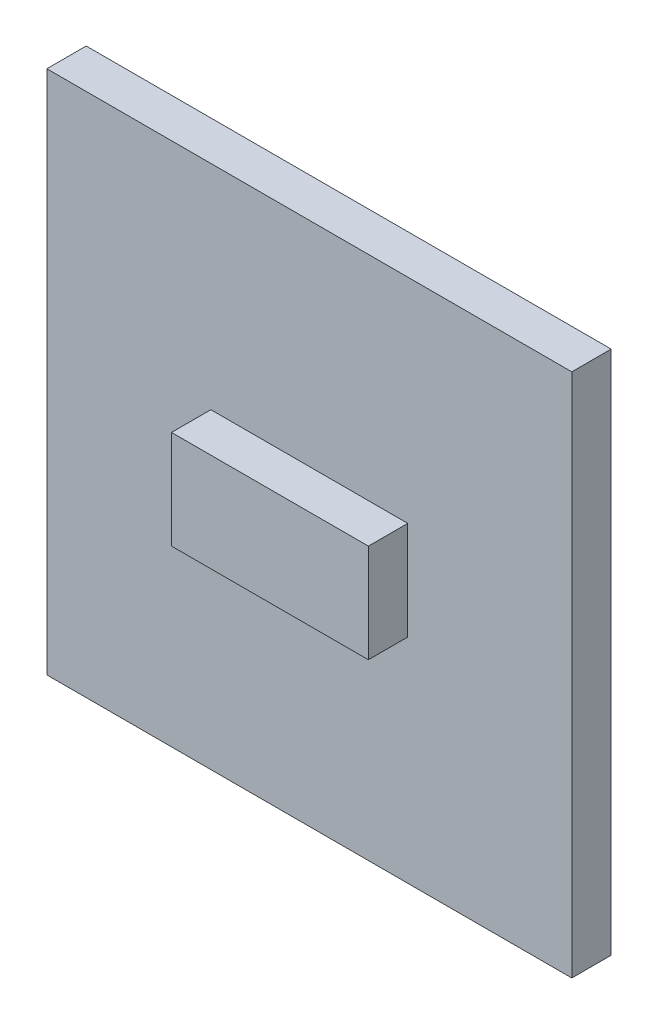
ISO-10303-21;
HEADER;
FILE_DESCRIPTION(('STEP AP214'),'2;1');
FILE_NAME('part.step','',(''),(''),'','','');
FILE_SCHEMA(('AUTOMOTIVE_DESIGN { 1 0 10303 214 1 1 1 1 }'));
ENDSEC;
DATA;
#1=APPLICATION_CONTEXT('core data for automotive mechanical design processes');
#2=APPLICATION_PROTOCOL_DEFINITION('international standard','automotive_design',2000,#1);
#3=PRODUCT_CONTEXT('',#1,'mechanical');
#4=PRODUCT('Part','Part','',(#3));
#5=PRODUCT_RELATED_PRODUCT_CATEGORY('part','',(#4));
#6=PRODUCT_DEFINITION_FORMATION('','',#4);
#7=PRODUCT_DEFINITION_CONTEXT('part definition',#1,'design');
#8=PRODUCT_DEFINITION('design','',#6,#7);
#9=PRODUCT_DEFINITION_SHAPE('','',#8);
#10=(LENGTH_UNIT() NAMED_UNIT(*) SI_UNIT(.MILLI.,.METRE.));
#11=(NAMED_UNIT(*) PLANE_ANGLE_UNIT() SI_UNIT($,.RADIAN.));
#12=(NAMED_UNIT(*) SI_UNIT($,.STERADIAN.) SOLID_ANGLE_UNIT());
#13=UNCERTAINTY_MEASURE_WITH_UNIT(LENGTH_MEASURE(1.E-05),#10,'distance_accuracy_value','');
#14=(GEOMETRIC_REPRESENTATION_CONTEXT(3) GLOBAL_UNCERTAINTY_ASSIGNED_CONTEXT((#13)) GLOBAL_UNIT_ASSIGNED_CONTEXT((#10,
#11,#12)) REPRESENTATION_CONTEXT('',''));
#15=CARTESIAN_POINT('',(0.,0.,0.));
#16=DIRECTION('',(0.,0.,1.));
#17=DIRECTION('',(1.,0.,0.));
#18=AXIS2_PLACEMENT_3D('',#15,#16,#17);
#19=CARTESIAN_POINT('',(0.,0.,1.2));
#20=DIRECTION('',(1.,0.,0.));
#21=DIRECTION('',(0.,1.,0.));
#22=AXIS2_PLACEMENT_3D('',#19,#20,#21);
#23=PLANE('',#22);
#24=DIRECTION('',(0.,-1.,0.));
#25=VECTOR('',#24,1.);
#26=CARTESIAN_POINT('',(0.,0.,0.));
#27=LINE('',#26,#25);
#28=CARTESIAN_POINT('',(0.,0.,0.));
#29=VERTEX_POINT('',#28);
#30=CARTESIAN_POINT('',(0.,-16.,0.));
#31=VERTEX_POINT('',#30);
#32=EDGE_CURVE('E117',#29,#31,#27,.T.);
#33=ORIENTED_EDGE('',*,*,#32,.T.);
#34=DIRECTION('',(0.,0.,-1.));
#35=VECTOR('',#34,1.);
#36=CARTESIAN_POINT('',(0.,-16.,1.2));
#37=LINE('',#36,#35);
#38=CARTESIAN_POINT('',(0.,-16.,1.2));
#39=VERTEX_POINT('',#38);
#40=EDGE_CURVE('E11',#39,#31,#37,.T.);
#41=ORIENTED_EDGE('',*,*,#40,.F.);
#42=DIRECTION('',(0.,-1.,0.));
#43=VECTOR('',#42,1.);
#44=CARTESIAN_POINT('',(0.,0.,1.2));
#45=LINE('',#44,#43);
#46=CARTESIAN_POINT('',(0.,0.,1.2));
#47=VERTEX_POINT('',#46);
#48=EDGE_CURVE('E126',#47,#39,#45,.T.);
#49=ORIENTED_EDGE('',*,*,#48,.F.);
#50=DIRECTION('',(0.,0.,-1.));
#51=VECTOR('',#50,1.);
#52=CARTESIAN_POINT('',(0.,0.,1.2));
#53=LINE('',#52,#51);
#54=EDGE_CURVE('E135',#47,#29,#53,.T.);
#55=ORIENTED_EDGE('',*,*,#54,.T.);
#56=EDGE_LOOP('',(#33,#41,#49,#55));
#57=FACE_BOUND('',#56,.T.);
#58=ADVANCED_FACE('F33',(#57),#23,.F.);
#59=CARTESIAN_POINT('',(0.,-16.,1.2));
#60=DIRECTION('',(0.,1.,0.));
#61=DIRECTION('',(0.,0.,1.));
#62=AXIS2_PLACEMENT_3D('',#59,#60,#61);
#63=PLANE('',#62);
#64=DIRECTION('',(1.,0.,0.));
#65=VECTOR('',#64,1.);
#66=CARTESIAN_POINT('',(0.,-16.,0.));
#67=LINE('',#66,#65);
#68=CARTESIAN_POINT('',(16.,-16.,0.));
#69=VERTEX_POINT('',#68);
#70=EDGE_CURVE('E120',#31,#69,#67,.T.);
#71=ORIENTED_EDGE('',*,*,#70,.T.);
#72=DIRECTION('',(0.,0.,-1.));
#73=VECTOR('',#72,1.);
#74=CARTESIAN_POINT('',(16.,-16.,1.2));
#75=LINE('',#74,#73);
#76=CARTESIAN_POINT('',(16.,-16.,1.2));
#77=VERTEX_POINT('',#76);
#78=EDGE_CURVE('E40',#77,#69,#75,.T.);
#79=ORIENTED_EDGE('',*,*,#78,.F.);
#80=DIRECTION('',(1.,0.,0.));
#81=VECTOR('',#80,1.);
#82=CARTESIAN_POINT('',(0.,-16.,1.2));
#83=LINE('',#82,#81);
#84=EDGE_CURVE('E129',#39,#77,#83,.T.);
#85=ORIENTED_EDGE('',*,*,#84,.F.);
#86=ORIENTED_EDGE('',*,*,#40,.T.);
#87=EDGE_LOOP('',(#71,#79,#85,#86));
#88=FACE_BOUND('',#87,.T.);
#89=ADVANCED_FACE('F166',(#88),#63,.F.);
#90=CARTESIAN_POINT('',(16.,0.,1.2));
#91=DIRECTION('',(-1.,0.,0.));
#92=DIRECTION('',(0.,-1.,0.));
#93=AXIS2_PLACEMENT_3D('',#90,#91,#92);
#94=PLANE('',#93);
#95=DIRECTION('',(0.,1.,0.));
#96=VECTOR('',#95,1.);
#97=CARTESIAN_POINT('',(16.,0.,0.));
#98=LINE('',#97,#96);
#99=CARTESIAN_POINT('',(16.,0.,0.));
#100=VERTEX_POINT('',#99);
#101=EDGE_CURVE('E138',#69,#100,#98,.T.);
#102=ORIENTED_EDGE('',*,*,#101,.T.);
#103=DIRECTION('',(0.,0.,-1.));
#104=VECTOR('',#103,1.);
#105=CARTESIAN_POINT('',(16.,0.,1.2));
#106=LINE('',#105,#104);
#107=CARTESIAN_POINT('',(16.,0.,1.2));
#108=VERTEX_POINT('',#107);
#109=EDGE_CURVE('E143',#108,#100,#106,.T.);
#110=ORIENTED_EDGE('',*,*,#109,.F.);
#111=DIRECTION('',(0.,1.,0.));
#112=VECTOR('',#111,1.);
#113=CARTESIAN_POINT('',(16.,0.,1.2));
#114=LINE('',#113,#112);
#115=EDGE_CURVE('E132',#77,#108,#114,.T.);
#116=ORIENTED_EDGE('',*,*,#115,.F.);
#117=ORIENTED_EDGE('',*,*,#78,.T.);
#118=EDGE_LOOP('',(#102,#110,#116,#117));
#119=FACE_BOUND('',#118,.T.);
#120=ADVANCED_FACE('F150',(#119),#94,.F.);
#121=CARTESIAN_POINT('',(0.,0.,1.2));
#122=DIRECTION('',(0.,-1.,0.));
#123=DIRECTION('',(0.,0.,-1.));
#124=AXIS2_PLACEMENT_3D('',#121,#122,#123);
#125=PLANE('',#124);
#126=DIRECTION('',(-1.,0.,0.));
#127=VECTOR('',#126,1.);
#128=CARTESIAN_POINT('',(0.,0.,0.));
#129=LINE('',#128,#127);
#130=EDGE_CURVE('E130',#100,#29,#129,.T.);
#131=ORIENTED_EDGE('',*,*,#130,.T.);
#132=ORIENTED_EDGE('',*,*,#54,.F.);
#133=DIRECTION('',(-1.,0.,0.));
#134=VECTOR('',#133,1.);
#135=CARTESIAN_POINT('',(0.,0.,1.2));
#136=LINE('',#135,#134);
#137=EDGE_CURVE('E134',#108,#47,#136,.T.);
#138=ORIENTED_EDGE('',*,*,#137,.F.);
#139=ORIENTED_EDGE('',*,*,#109,.T.);
#140=EDGE_LOOP('',(#131,#132,#138,#139));
#141=FACE_BOUND('',#140,.T.);
#142=ADVANCED_FACE('F159',(#141),#125,.F.);
#143=CARTESIAN_POINT('',(0.,0.,1.2));
#144=DIRECTION('',(0.,0.,1.));
#145=DIRECTION('',(1.,0.,0.));
#146=AXIS2_PLACEMENT_3D('',#143,#144,#145);
#147=PLANE('',#146);
#148=DIRECTION('',(0.,-1.,0.));
#149=VECTOR('',#148,1.);
#150=CARTESIAN_POINT('',(5.,-6.5,1.2));
#151=LINE('',#150,#149);
#152=CARTESIAN_POINT('',(5.,-6.5,1.2));
#153=VERTEX_POINT('',#152);
#154=CARTESIAN_POINT('',(5.,-9.5,1.2));
#155=VERTEX_POINT('',#154);
#156=EDGE_CURVE('E47',#153,#155,#151,.T.);
#157=ORIENTED_EDGE('',*,*,#156,.F.);
#158=DIRECTION('',(-1.,0.,0.));
#159=VECTOR('',#158,1.);
#160=CARTESIAN_POINT('',(5.,-6.5,1.2));
#161=LINE('',#160,#159);
#162=CARTESIAN_POINT('',(11.,-6.5,1.2));
#163=VERTEX_POINT('',#162);
#164=EDGE_CURVE('E51',#163,#153,#161,.T.);
#165=ORIENTED_EDGE('',*,*,#164,.F.);
#166=DIRECTION('',(0.,1.,0.));
#167=VECTOR('',#166,1.);
#168=CARTESIAN_POINT('',(11.,-6.5,1.2));
#169=LINE('',#168,#167);
#170=CARTESIAN_POINT('',(11.,-9.5,1.2));
#171=VERTEX_POINT('',#170);
#172=EDGE_CURVE('E260',#171,#163,#169,.T.);
#173=ORIENTED_EDGE('',*,*,#172,.F.);
#174=DIRECTION('',(1.,0.,0.));
#175=VECTOR('',#174,1.);
#176=CARTESIAN_POINT('',(5.,-9.5,1.2));
#177=LINE('',#176,#175);
#178=EDGE_CURVE('E266',#155,#171,#177,.T.);
#179=ORIENTED_EDGE('',*,*,#178,.F.);
#180=EDGE_LOOP('',(#157,#165,#173,#179));
#181=FACE_BOUND('',#180,.T.);
#182=ORIENTED_EDGE('',*,*,#48,.T.);
#183=ORIENTED_EDGE('',*,*,#84,.T.);
#184=ORIENTED_EDGE('',*,*,#115,.T.);
#185=ORIENTED_EDGE('',*,*,#137,.T.);
#186=EDGE_LOOP('',(#182,#183,#184,#185));
#187=FACE_BOUND('',#186,.T.);
#188=ADVANCED_FACE('F165',(#181,#187),#147,.T.);
#189=CARTESIAN_POINT('',(0.,0.,0.));
#190=DIRECTION('',(0.,0.,1.));
#191=DIRECTION('',(1.,0.,0.));
#192=AXIS2_PLACEMENT_3D('',#189,#190,#191);
#193=PLANE('',#192);
#194=ORIENTED_EDGE('',*,*,#32,.F.);
#195=ORIENTED_EDGE('',*,*,#130,.F.);
#196=ORIENTED_EDGE('',*,*,#101,.F.);
#197=ORIENTED_EDGE('',*,*,#70,.F.);
#198=EDGE_LOOP('',(#194,#195,#196,#197));
#199=FACE_BOUND('',#198,.T.);
#200=ADVANCED_FACE('F156',(#199),#193,.F.);
#201=CARTESIAN_POINT('',(5.,-6.5,2.4));
#202=DIRECTION('',(1.,0.,0.));
#203=DIRECTION('',(0.,0.,-1.));
#204=AXIS2_PLACEMENT_3D('',#201,#202,#203);
#205=PLANE('',#204);
#206=ORIENTED_EDGE('',*,*,#156,.T.);
#207=DIRECTION('',(0.,0.,-1.));
#208=VECTOR('',#207,1.);
#209=CARTESIAN_POINT('',(5.,-9.5,2.4));
#210=LINE('',#209,#208);
#211=CARTESIAN_POINT('',(5.,-9.5,2.4));
#212=VERTEX_POINT('',#211);
#213=EDGE_CURVE('E100',#212,#155,#210,.T.);
#214=ORIENTED_EDGE('',*,*,#213,.F.);
#215=DIRECTION('',(0.,-1.,0.));
#216=VECTOR('',#215,1.);
#217=CARTESIAN_POINT('',(5.,-6.5,2.4));
#218=LINE('',#217,#216);
#219=CARTESIAN_POINT('',(5.,-6.5,2.4));
#220=VERTEX_POINT('',#219);
#221=EDGE_CURVE('E106',#220,#212,#218,.T.);
#222=ORIENTED_EDGE('',*,*,#221,.F.);
#223=DIRECTION('',(0.,0.,-1.));
#224=VECTOR('',#223,1.);
#225=CARTESIAN_POINT('',(5.,-6.5,2.4));
#226=LINE('',#225,#224);
#227=EDGE_CURVE('E258',#220,#153,#226,.T.);
#228=ORIENTED_EDGE('',*,*,#227,.T.);
#229=EDGE_LOOP('',(#206,#214,#222,#228));
#230=FACE_BOUND('',#229,.T.);
#231=ADVANCED_FACE('F116',(#230),#205,.F.);
#232=CARTESIAN_POINT('',(5.,-9.5,2.4));
#233=DIRECTION('',(0.,1.,0.));
#234=DIRECTION('',(-1.,0.,0.));
#235=AXIS2_PLACEMENT_3D('',#232,#233,#234);
#236=PLANE('',#235);
#237=ORIENTED_EDGE('',*,*,#178,.T.);
#238=DIRECTION('',(0.,0.,-1.));
#239=VECTOR('',#238,1.);
#240=CARTESIAN_POINT('',(11.,-9.5,2.4));
#241=LINE('',#240,#239);
#242=CARTESIAN_POINT('',(11.,-9.5,2.4));
#243=VERTEX_POINT('',#242);
#244=EDGE_CURVE('E102',#243,#171,#241,.T.);
#245=ORIENTED_EDGE('',*,*,#244,.F.);
#246=DIRECTION('',(1.,0.,0.));
#247=VECTOR('',#246,1.);
#248=CARTESIAN_POINT('',(5.,-9.5,2.4));
#249=LINE('',#248,#247);
#250=EDGE_CURVE('E95',#212,#243,#249,.T.);
#251=ORIENTED_EDGE('',*,*,#250,.F.);
#252=ORIENTED_EDGE('',*,*,#213,.T.);
#253=EDGE_LOOP('',(#237,#245,#251,#252));
#254=FACE_BOUND('',#253,.T.);
#255=ADVANCED_FACE('F98',(#254),#236,.F.);
#256=CARTESIAN_POINT('',(11.,-6.5,2.4));
#257=DIRECTION('',(-1.,0.,0.));
#258=DIRECTION('',(0.,0.,1.));
#259=AXIS2_PLACEMENT_3D('',#256,#257,#258);
#260=PLANE('',#259);
#261=ORIENTED_EDGE('',*,*,#172,.T.);
#262=DIRECTION('',(0.,0.,-1.));
#263=VECTOR('',#262,1.);
#264=CARTESIAN_POINT('',(11.,-6.5,2.4));
#265=LINE('',#264,#263);
#266=CARTESIAN_POINT('',(11.,-6.5,2.4));
#267=VERTEX_POINT('',#266);
#268=EDGE_CURVE('E122',#267,#163,#265,.T.);
#269=ORIENTED_EDGE('',*,*,#268,.F.);
#270=DIRECTION('',(0.,1.,0.));
#271=VECTOR('',#270,1.);
#272=CARTESIAN_POINT('',(11.,-6.5,2.4));
#273=LINE('',#272,#271);
#274=EDGE_CURVE('E105',#243,#267,#273,.T.);
#275=ORIENTED_EDGE('',*,*,#274,.F.);
#276=ORIENTED_EDGE('',*,*,#244,.T.);
#277=EDGE_LOOP('',(#261,#269,#275,#276));
#278=FACE_BOUND('',#277,.T.);
#279=ADVANCED_FACE('F184',(#278),#260,.F.);
#280=CARTESIAN_POINT('',(5.,-6.5,2.4));
#281=DIRECTION('',(0.,-1.,0.));
#282=DIRECTION('',(1.,0.,0.));
#283=AXIS2_PLACEMENT_3D('',#280,#281,#282);
#284=PLANE('',#283);
#285=ORIENTED_EDGE('',*,*,#164,.T.);
#286=ORIENTED_EDGE('',*,*,#227,.F.);
#287=DIRECTION('',(-1.,0.,0.));
#288=VECTOR('',#287,1.);
#289=CARTESIAN_POINT('',(5.,-6.5,2.4));
#290=LINE('',#289,#288);
#291=EDGE_CURVE('E111',#267,#220,#290,.T.);
#292=ORIENTED_EDGE('',*,*,#291,.F.);
#293=ORIENTED_EDGE('',*,*,#268,.T.);
#294=EDGE_LOOP('',(#285,#286,#292,#293));
#295=FACE_BOUND('',#294,.T.);
#296=ADVANCED_FACE('F187',(#295),#284,.F.);
#297=CARTESIAN_POINT('',(0.,0.,2.4));
#298=DIRECTION('',(0.,0.,1.));
#299=DIRECTION('',(1.,0.,0.));
#300=AXIS2_PLACEMENT_3D('',#297,#298,#299);
#301=PLANE('',#300);
#302=ORIENTED_EDGE('',*,*,#221,.T.);
#303=ORIENTED_EDGE('',*,*,#250,.T.);
#304=ORIENTED_EDGE('',*,*,#274,.T.);
#305=ORIENTED_EDGE('',*,*,#291,.T.);
#306=EDGE_LOOP('',(#302,#303,#304,#305));
#307=FACE_BOUND('',#306,.T.);
#308=ADVANCED_FACE('F109',(#307),#301,.T.);
#309=CLOSED_SHELL('',(#58,#89,#120,#142,#188,#200,#231,#255,#279,#296,#308));
#310=MANIFOLD_SOLID_BREP('B2',#309);
#311=ADVANCED_BREP_SHAPE_REPRESENTATION('',(#18,#310),#14);
#312=SHAPE_DEFINITION_REPRESENTATION(#9,#311);
ENDSEC;
END-ISO-10303-21;
